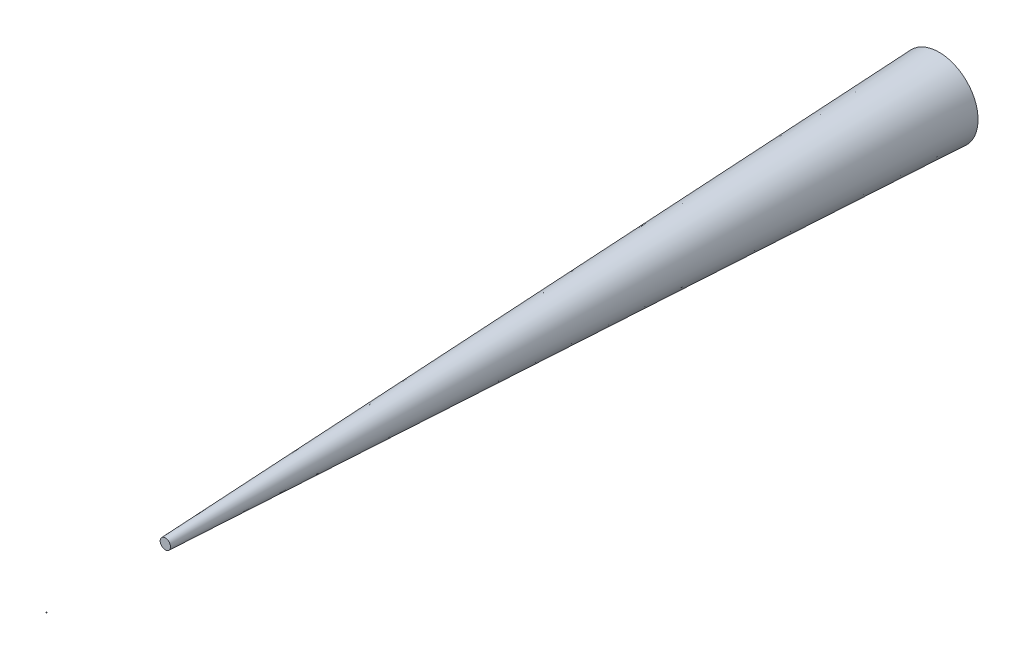
ISO-10303-21;
HEADER;
FILE_DESCRIPTION(('STEP AP214'),'2;1');
FILE_NAME('part.step','',(''),(''),'','','');
FILE_SCHEMA(('AUTOMOTIVE_DESIGN { 1 0 10303 214 1 1 1 1 }'));
ENDSEC;
DATA;
#1=APPLICATION_CONTEXT('core data for automotive mechanical design processes');
#2=APPLICATION_PROTOCOL_DEFINITION('international standard','automotive_design',2000,#1);
#3=PRODUCT_CONTEXT('',#1,'mechanical');
#4=PRODUCT('Part','Part','',(#3));
#5=PRODUCT_RELATED_PRODUCT_CATEGORY('part','',(#4));
#6=PRODUCT_DEFINITION_FORMATION('','',#4);
#7=PRODUCT_DEFINITION_CONTEXT('part definition',#1,'design');
#8=PRODUCT_DEFINITION('design','',#6,#7);
#9=PRODUCT_DEFINITION_SHAPE('','',#8);
#10=(LENGTH_UNIT() NAMED_UNIT(*) SI_UNIT(.MILLI.,.METRE.));
#11=(NAMED_UNIT(*) PLANE_ANGLE_UNIT() SI_UNIT($,.RADIAN.));
#12=(NAMED_UNIT(*) SI_UNIT($,.STERADIAN.) SOLID_ANGLE_UNIT());
#13=UNCERTAINTY_MEASURE_WITH_UNIT(LENGTH_MEASURE(1.E-05),#10,'distance_accuracy_value','');
#14=(GEOMETRIC_REPRESENTATION_CONTEXT(3) GLOBAL_UNCERTAINTY_ASSIGNED_CONTEXT((#13)) GLOBAL_UNIT_ASSIGNED_CONTEXT((#10,
#11,#12)) REPRESENTATION_CONTEXT('',''));
#15=CARTESIAN_POINT('',(0.,0.,0.));
#16=DIRECTION('',(0.,0.,1.));
#17=DIRECTION('',(1.,0.,0.));
#18=AXIS2_PLACEMENT_3D('',#15,#16,#17);
#19=CARTESIAN_POINT('',(0.500000000000001,0.5,-1.));
#20=DIRECTION('',(1.,0.,0.));
#21=DIRECTION('',(0.,0.,-1.));
#22=AXIS2_PLACEMENT_3D('',#19,#20,#21);
#23=PLANE('',#22);
#24=DIRECTION('',(0.,1.,0.));
#25=VECTOR('',#24,1.);
#26=CARTESIAN_POINT('',(0.500000000000001,0.5,0.));
#27=LINE('',#26,#25);
#28=CARTESIAN_POINT('',(0.500000000000001,-0.5,0.));
#29=VERTEX_POINT('',#28);
#30=CARTESIAN_POINT('',(0.500000000000001,0.5,0.));
#31=VERTEX_POINT('',#30);
#32=EDGE_CURVE('E105',#29,#31,#27,.T.);
#33=ORIENTED_EDGE('',*,*,#32,.F.);
#34=DIRECTION('',(0.,0.,1.));
#35=VECTOR('',#34,1.);
#36=CARTESIAN_POINT('',(0.500000000000001,-0.5,-1.));
#37=LINE('',#36,#35);
#38=CARTESIAN_POINT('',(0.500000000000001,-0.5,-1.));
#39=VERTEX_POINT('',#38);
#40=EDGE_CURVE('E12',#39,#29,#37,.T.);
#41=ORIENTED_EDGE('',*,*,#40,.F.);
#42=DIRECTION('',(0.,1.,0.));
#43=VECTOR('',#42,1.);
#44=CARTESIAN_POINT('',(0.500000000000001,0.5,-1.));
#45=LINE('',#44,#43);
#46=CARTESIAN_POINT('',(0.500000000000001,0.5,-1.));
#47=VERTEX_POINT('',#46);
#48=EDGE_CURVE('E99',#39,#47,#45,.T.);
#49=ORIENTED_EDGE('',*,*,#48,.T.);
#50=DIRECTION('',(0.,0.,1.));
#51=VECTOR('',#50,1.);
#52=CARTESIAN_POINT('',(0.500000000000001,0.5,-1.));
#53=LINE('',#52,#51);
#54=EDGE_CURVE('E44',#47,#31,#53,.T.);
#55=ORIENTED_EDGE('',*,*,#54,.T.);
#56=EDGE_LOOP('',(#33,#41,#49,#55));
#57=FACE_BOUND('',#56,.T.);
#58=ADVANCED_FACE('F41',(#57),#23,.T.);
#59=CARTESIAN_POINT('',(-0.499999999999998,-0.5,-1.));
#60=DIRECTION('',(0.,-1.,0.));
#61=DIRECTION('',(0.,0.,-1.));
#62=AXIS2_PLACEMENT_3D('',#59,#60,#61);
#63=PLANE('',#62);
#64=DIRECTION('',(1.,0.,0.));
#65=VECTOR('',#64,1.);
#66=CARTESIAN_POINT('',(-0.499999999999998,-0.5,0.));
#67=LINE('',#66,#65);
#68=CARTESIAN_POINT('',(-0.499999999999998,-0.5,0.));
#69=VERTEX_POINT('',#68);
#70=EDGE_CURVE('E101',#69,#29,#67,.T.);
#71=ORIENTED_EDGE('',*,*,#70,.F.);
#72=DIRECTION('',(0.,0.,1.));
#73=VECTOR('',#72,1.);
#74=CARTESIAN_POINT('',(-0.499999999999998,-0.5,-1.));
#75=LINE('',#74,#73);
#76=CARTESIAN_POINT('',(-0.499999999999998,-0.5,-1.));
#77=VERTEX_POINT('',#76);
#78=EDGE_CURVE('E50',#77,#69,#75,.T.);
#79=ORIENTED_EDGE('',*,*,#78,.F.);
#80=DIRECTION('',(1.,0.,0.));
#81=VECTOR('',#80,1.);
#82=CARTESIAN_POINT('',(-0.499999999999998,-0.5,-1.));
#83=LINE('',#82,#81);
#84=EDGE_CURVE('E96',#77,#39,#83,.T.);
#85=ORIENTED_EDGE('',*,*,#84,.T.);
#86=ORIENTED_EDGE('',*,*,#40,.T.);
#87=EDGE_LOOP('',(#71,#79,#85,#86));
#88=FACE_BOUND('',#87,.T.);
#89=ADVANCED_FACE('F115',(#88),#63,.T.);
#90=CARTESIAN_POINT('',(-0.499999999999997,0.499999999999999,-1.));
#91=DIRECTION('',(-1.,0.,0.));
#92=DIRECTION('',(0.,-1.,0.));
#93=AXIS2_PLACEMENT_3D('',#90,#91,#92);
#94=PLANE('',#93);
#95=DIRECTION('',(0.,-1.,0.));
#96=VECTOR('',#95,1.);
#97=CARTESIAN_POINT('',(-0.499999999999997,0.499999999999999,0.));
#98=LINE('',#97,#96);
#99=CARTESIAN_POINT('',(-0.499999999999997,0.499999999999999,0.));
#100=VERTEX_POINT('',#99);
#101=EDGE_CURVE('E91',#100,#69,#98,.T.);
#102=ORIENTED_EDGE('',*,*,#101,.F.);
#103=DIRECTION('',(0.,0.,1.));
#104=VECTOR('',#103,1.);
#105=CARTESIAN_POINT('',(-0.499999999999997,0.499999999999999,-1.));
#106=LINE('',#105,#104);
#107=CARTESIAN_POINT('',(-0.499999999999997,0.499999999999999,-1.));
#108=VERTEX_POINT('',#107);
#109=EDGE_CURVE('E86',#108,#100,#106,.T.);
#110=ORIENTED_EDGE('',*,*,#109,.F.);
#111=DIRECTION('',(0.,-1.,0.));
#112=VECTOR('',#111,1.);
#113=CARTESIAN_POINT('',(-0.499999999999997,0.499999999999999,-1.));
#114=LINE('',#113,#112);
#115=EDGE_CURVE('E89',#108,#77,#114,.T.);
#116=ORIENTED_EDGE('',*,*,#115,.T.);
#117=ORIENTED_EDGE('',*,*,#78,.T.);
#118=EDGE_LOOP('',(#102,#110,#116,#117));
#119=FACE_BOUND('',#118,.T.);
#120=ADVANCED_FACE('F88',(#119),#94,.T.);
#121=CARTESIAN_POINT('',(-0.499999999999997,0.499999999999999,-1.));
#122=DIRECTION('',(0.,1.,0.));
#123=DIRECTION('',(-1.,0.,0.));
#124=AXIS2_PLACEMENT_3D('',#121,#122,#123);
#125=PLANE('',#124);
#126=DIRECTION('',(-1.,0.,0.));
#127=VECTOR('',#126,1.);
#128=CARTESIAN_POINT('',(-0.499999999999997,0.499999999999999,0.));
#129=LINE('',#128,#127);
#130=EDGE_CURVE('E108',#31,#100,#129,.T.);
#131=ORIENTED_EDGE('',*,*,#130,.F.);
#132=ORIENTED_EDGE('',*,*,#54,.F.);
#133=DIRECTION('',(-1.,0.,0.));
#134=VECTOR('',#133,1.);
#135=CARTESIAN_POINT('',(-0.499999999999997,0.499999999999999,-1.));
#136=LINE('',#135,#134);
#137=EDGE_CURVE('E95',#47,#108,#136,.T.);
#138=ORIENTED_EDGE('',*,*,#137,.T.);
#139=ORIENTED_EDGE('',*,*,#109,.T.);
#140=EDGE_LOOP('',(#131,#132,#138,#139));
#141=FACE_BOUND('',#140,.T.);
#142=ADVANCED_FACE('F98',(#141),#125,.T.);
#143=CARTESIAN_POINT('',(0.,0.,-1.));
#144=DIRECTION('',(0.,0.,1.));
#145=DIRECTION('',(1.,0.,0.));
#146=AXIS2_PLACEMENT_3D('',#143,#144,#145);
#147=PLANE('',#146);
#148=ORIENTED_EDGE('',*,*,#48,.F.);
#149=ORIENTED_EDGE('',*,*,#84,.F.);
#150=ORIENTED_EDGE('',*,*,#115,.F.);
#151=ORIENTED_EDGE('',*,*,#137,.F.);
#152=EDGE_LOOP('',(#148,#149,#150,#151));
#153=FACE_BOUND('',#152,.T.);
#154=ADVANCED_FACE('F94',(#153),#147,.F.);
#155=CARTESIAN_POINT('',(0.,0.,0.));
#156=DIRECTION('',(0.,0.,1.));
#157=DIRECTION('',(1.,0.,0.));
#158=AXIS2_PLACEMENT_3D('',#155,#156,#157);
#159=PLANE('',#158);
#160=ORIENTED_EDGE('',*,*,#32,.T.);
#161=ORIENTED_EDGE('',*,*,#130,.T.);
#162=ORIENTED_EDGE('',*,*,#101,.T.);
#163=ORIENTED_EDGE('',*,*,#70,.T.);
#164=EDGE_LOOP('',(#160,#161,#162,#163));
#165=FACE_BOUND('',#164,.T.);
#166=ADVANCED_FACE('F114',(#165),#159,.T.);
#167=CLOSED_SHELL('',(#58,#89,#120,#142,#154,#166));
#168=MANIFOLD_SOLID_BREP('B2',#167);
#169=CARTESIAN_POINT('',(0.,0.,0.));
#170=DIRECTION('',(0.,0.,-1.));
#171=DIRECTION('',(-1.,0.,0.));
#172=AXIS2_PLACEMENT_3D('',#169,#170,#171);
#173=CONICAL_SURFACE('',#172,0.,0.043633231299851);
#174=CARTESIAN_POINT('',(0.,0.,-200.));
#175=DIRECTION('',(0.,0.,-1.));
#176=DIRECTION('',(-1.,0.,0.));
#177=AXIS2_PLACEMENT_3D('',#174,#175,#176);
#178=CIRCLE('',#177,8.73218858170095);
#179=CARTESIAN_POINT('',(-8.73218858170095,0.,-200.));
#180=VERTEX_POINT('',#179);
#181=EDGE_CURVE('E40',#180,#180,#178,.F.);
#182=CARTESIAN_POINT('',(0.,0.,-1500.));
#183=DIRECTION('',(0.,0.,1.));
#184=DIRECTION('',(1.,0.,0.));
#185=AXIS2_PLACEMENT_3D('',#182,#183,#184);
#186=CIRCLE('',#185,65.4914143627571);
#187=CARTESIAN_POINT('',(-65.4914143627571,0.,-1500.));
#188=VERTEX_POINT('',#187);
#189=EDGE_CURVE('E171',#188,#188,#186,.T.);
#190=CARTESIAN_POINT('',(-8.73218858170095,0.,-200.));
#191=CARTESIAN_POINT('',(-9.32343051692029,0.,-213.541666666667));
#192=CARTESIAN_POINT('',(-9.91467245213962,0.,-227.083333333333));
#193=CARTESIAN_POINT('',(-11.0971563225783,0.,-254.166666666667));
#194=CARTESIAN_POINT('',(-11.6883982577976,0.,-267.708333333333));
#195=CARTESIAN_POINT('',(-12.8708821282363,0.,-294.791666666667));
#196=CARTESIAN_POINT('',(-13.4621240634556,0.,-308.333333333333));
#197=CARTESIAN_POINT('',(-14.6446079338943,0.,-335.416666666667));
#198=CARTESIAN_POINT('',(-15.2358498691136,0.,-348.958333333333));
#199=CARTESIAN_POINT('',(-16.4183337395523,0.,-376.041666666667));
#200=CARTESIAN_POINT('',(-17.0095756747716,0.,-389.583333333333));
#201=CARTESIAN_POINT('',(-18.1920595452103,0.,-416.666666666667));
#202=CARTESIAN_POINT('',(-18.7833014804297,0.,-430.208333333333));
#203=CARTESIAN_POINT('',(-19.9657853508683,0.,-457.291666666667));
#204=CARTESIAN_POINT('',(-20.5570272860877,0.,-470.833333333333));
#205=CARTESIAN_POINT('',(-21.7395111565263,0.,-497.916666666667));
#206=CARTESIAN_POINT('',(-22.3307530917457,0.,-511.458333333333));
#207=CARTESIAN_POINT('',(-23.5132369621843,0.,-538.541666666667));
#208=CARTESIAN_POINT('',(-24.1044788974037,0.,-552.083333333333));
#209=CARTESIAN_POINT('',(-25.2869627678423,0.,-579.166666666667));
#210=CARTESIAN_POINT('',(-25.8782047030617,0.,-592.708333333333));
#211=CARTESIAN_POINT('',(-27.0606885735003,0.,-619.791666666667));
#212=CARTESIAN_POINT('',(-27.6519305087197,0.,-633.333333333333));
#213=CARTESIAN_POINT('',(-28.8344143791584,0.,-660.416666666667));
#214=CARTESIAN_POINT('',(-29.4256563143777,0.,-673.958333333333));
#215=CARTESIAN_POINT('',(-30.6081401848164,0.,-701.041666666667));
#216=CARTESIAN_POINT('',(-31.1993821200357,0.,-714.583333333333));
#217=CARTESIAN_POINT('',(-32.3818659904744,0.,-741.666666666667));
#218=CARTESIAN_POINT('',(-32.9731079256937,0.,-755.208333333333));
#219=CARTESIAN_POINT('',(-34.1555917961324,0.,-782.291666666667));
#220=CARTESIAN_POINT('',(-34.7468337313517,0.,-795.833333333333));
#221=CARTESIAN_POINT('',(-35.9293176017904,0.,-822.916666666667));
#222=CARTESIAN_POINT('',(-36.5205595370097,0.,-836.458333333333));
#223=CARTESIAN_POINT('',(-37.7030434074484,0.,-863.541666666667));
#224=CARTESIAN_POINT('',(-38.2942853426677,0.,-877.083333333333));
#225=CARTESIAN_POINT('',(-39.4767692131064,0.,-904.166666666667));
#226=CARTESIAN_POINT('',(-40.0680111483257,0.,-917.708333333333));
#227=CARTESIAN_POINT('',(-41.2504950187644,0.,-944.791666666667));
#228=CARTESIAN_POINT('',(-41.8417369539837,0.,-958.333333333333));
#229=CARTESIAN_POINT('',(-43.0242208244224,0.,-985.416666666667));
#230=CARTESIAN_POINT('',(-43.6154627596417,0.,-998.958333333333));
#231=CARTESIAN_POINT('',(-44.7979466300804,0.,-1026.04166666667));
#232=CARTESIAN_POINT('',(-45.3891885652997,0.,-1039.58333333333));
#233=CARTESIAN_POINT('',(-46.5716724357384,0.,-1066.66666666667));
#234=CARTESIAN_POINT('',(-47.1629143709578,0.,-1080.20833333333));
#235=CARTESIAN_POINT('',(-48.3453982413964,0.,-1107.29166666667));
#236=CARTESIAN_POINT('',(-48.9366401766158,0.,-1120.83333333333));
#237=CARTESIAN_POINT('',(-50.1191240470544,0.,-1147.91666666667));
#238=CARTESIAN_POINT('',(-50.7103659822738,0.,-1161.45833333333));
#239=CARTESIAN_POINT('',(-51.8928498527124,0.,-1188.54166666667));
#240=CARTESIAN_POINT('',(-52.4840917879318,0.,-1202.08333333333));
#241=CARTESIAN_POINT('',(-53.6665756583704,0.,-1229.16666666667));
#242=CARTESIAN_POINT('',(-54.2578175935898,0.,-1242.70833333333));
#243=CARTESIAN_POINT('',(-55.4403014640284,0.,-1269.79166666667));
#244=CARTESIAN_POINT('',(-56.0315433992478,0.,-1283.33333333333));
#245=CARTESIAN_POINT('',(-57.2140272696864,0.,-1310.41666666667));
#246=CARTESIAN_POINT('',(-57.8052692049058,0.,-1323.95833333333));
#247=CARTESIAN_POINT('',(-58.9877530753445,0.,-1351.04166666667));
#248=CARTESIAN_POINT('',(-59.5789950105638,0.,-1364.58333333333));
#249=CARTESIAN_POINT('',(-60.7614788810025,0.,-1391.66666666667));
#250=CARTESIAN_POINT('',(-61.3527208162218,0.,-1405.20833333333));
#251=CARTESIAN_POINT('',(-62.5352046866605,0.,-1432.29166666667));
#252=CARTESIAN_POINT('',(-63.1264466218798,0.,-1445.83333333333));
#253=CARTESIAN_POINT('',(-64.3089304923185,0.,-1472.91666666667));
#254=CARTESIAN_POINT('',(-64.9001724275378,0.,-1486.45833333333));
#255=CARTESIAN_POINT('',(-65.4914143627571,0.,-1500.));
#256=B_SPLINE_CURVE_WITH_KNOTS('',3,(#190,#191,#192,#193,#194,#195,#196,#197,#198,#199,#200,
#201,#202,#203,#204,#205,#206,#207,#208,#209,#210,#211,#212,#213,#214,#215,#216,#217,#218,#219,
#220,#221,#222,#223,#224,#225,#226,#227,#228,#229,#230,#231,#232,#233,#234,#235,#236,#237,#238,
#239,#240,#241,#242,#243,#244,#245,#246,#247,#248,#249,#250,#251,#252,#253,#254,#255),
.UNSPECIFIED.,.F.,.F.,(4,2,2,2,2,2,2,2,2,2,2,2,2,2,2,2,2,2,2,2,2,2,2,2,2,2,2,2,2,2,2,2,4),(0.,
40.6637028347599,81.3274056695197,121.99110850428,162.654811339039,203.318514173799,
243.982217008559,284.645919843319,325.309622678079,365.973325512839,406.637028347599,
447.300731182359,487.964434017118,528.628136851878,569.291839686638,609.955542521398,
650.619245356158,691.282948190918,731.946651025678,772.610353860437,813.274056695197,
853.937759529957,894.601462364717,935.265165199477,975.928868034236,1016.592570869,
1057.25627370376,1097.91997653852,1138.58367937328,1179.24738220804,1219.9110850428,
1260.57478787756,1301.23849071232),.UNSPECIFIED.);
#257=EDGE_CURVE('BSEAM165',#180,#188,#256,.T.);
#258=ORIENTED_EDGE('',*,*,#181,.F.);
#259=ORIENTED_EDGE('',*,*,#189,.T.);
#260=ORIENTED_EDGE('',*,*,#257,.T.);
#261=ORIENTED_EDGE('',*,*,#257,.F.);
#262=EDGE_LOOP('',(#258,#260,#259,#261));
#263=FACE_BOUND('',#262,.T.);
#264=ADVANCED_FACE('F165',(#263),#173,.T.);
#265=CARTESIAN_POINT('',(0.,0.,-1500.));
#266=DIRECTION('',(0.,0.,-1.));
#267=DIRECTION('',(-1.,0.,0.));
#268=AXIS2_PLACEMENT_3D('',#265,#266,#267);
#269=PLANE('',#268);
#270=ORIENTED_EDGE('',*,*,#189,.F.);
#271=EDGE_LOOP('',(#270));
#272=FACE_BOUND('',#271,.T.);
#273=ADVANCED_FACE('F178',(#272),#269,.T.);
#274=CARTESIAN_POINT('',(-65.4914143627571,-8.73218858170095,-200.));
#275=DIRECTION('',(0.,0.,-1.));
#276=DIRECTION('',(-1.,0.,0.));
#277=AXIS2_PLACEMENT_3D('',#274,#275,#276);
#278=PLANE('',#277);
#279=ORIENTED_EDGE('',*,*,#181,.T.);
#280=EDGE_LOOP('',(#279));
#281=FACE_BOUND('',#280,.T.);
#282=ADVANCED_FACE('F180',(#281),#278,.F.);
#283=CLOSED_SHELL('',(#264,#273,#282));
#284=MANIFOLD_SOLID_BREP('B6',#283);
#285=ADVANCED_BREP_SHAPE_REPRESENTATION('',(#18,#168,#284),#14);
#286=SHAPE_DEFINITION_REPRESENTATION(#9,#285);
ENDSEC;
END-ISO-10303-21;
